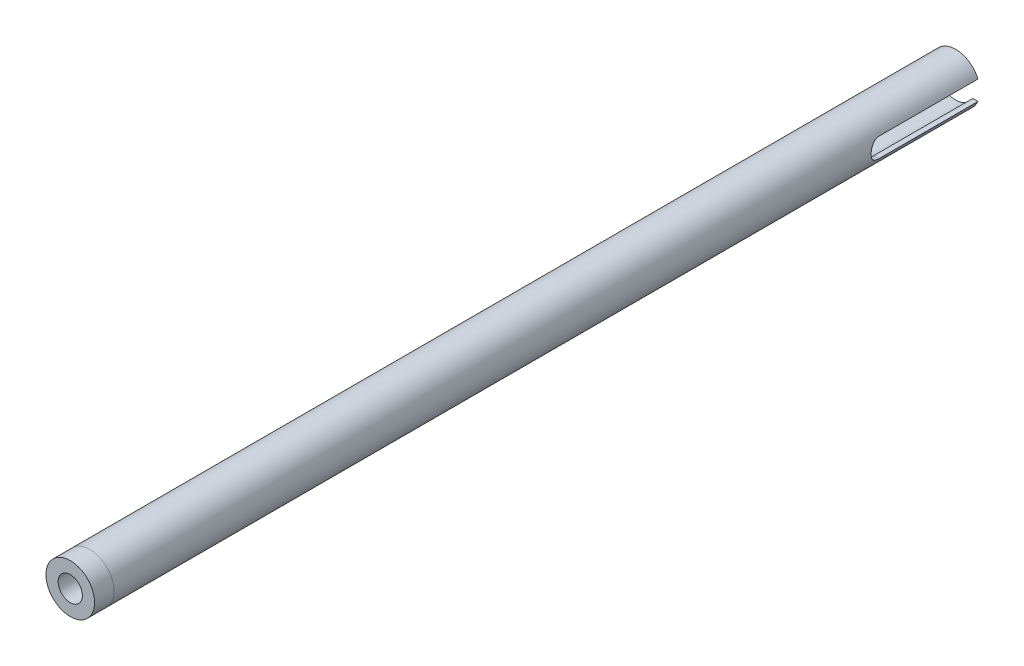
ISO-10303-21;
HEADER;
FILE_DESCRIPTION(('STEP AP214'),'2;1');
FILE_NAME('part.step','',(''),(''),'','','');
FILE_SCHEMA(('AUTOMOTIVE_DESIGN { 1 0 10303 214 1 1 1 1 }'));
ENDSEC;
DATA;
#1=APPLICATION_CONTEXT('core data for automotive mechanical design processes');
#2=APPLICATION_PROTOCOL_DEFINITION('international standard','automotive_design',2000,#1);
#3=PRODUCT_CONTEXT('',#1,'mechanical');
#4=PRODUCT('Part','Part','',(#3));
#5=PRODUCT_RELATED_PRODUCT_CATEGORY('part','',(#4));
#6=PRODUCT_DEFINITION_FORMATION('','',#4);
#7=PRODUCT_DEFINITION_CONTEXT('part definition',#1,'design');
#8=PRODUCT_DEFINITION('design','',#6,#7);
#9=PRODUCT_DEFINITION_SHAPE('','',#8);
#10=(LENGTH_UNIT() NAMED_UNIT(*) SI_UNIT(.MILLI.,.METRE.));
#11=(NAMED_UNIT(*) PLANE_ANGLE_UNIT() SI_UNIT($,.RADIAN.));
#12=(NAMED_UNIT(*) SI_UNIT($,.STERADIAN.) SOLID_ANGLE_UNIT());
#13=UNCERTAINTY_MEASURE_WITH_UNIT(LENGTH_MEASURE(1.E-05),#10,'distance_accuracy_value','');
#14=(GEOMETRIC_REPRESENTATION_CONTEXT(3) GLOBAL_UNCERTAINTY_ASSIGNED_CONTEXT((#13)) GLOBAL_UNIT_ASSIGNED_CONTEXT((#10,
#11,#12)) REPRESENTATION_CONTEXT('',''));
#15=CARTESIAN_POINT('',(0.,0.,0.));
#16=DIRECTION('',(0.,0.,1.));
#17=DIRECTION('',(1.,0.,0.));
#18=AXIS2_PLACEMENT_3D('',#15,#16,#17);
#19=CARTESIAN_POINT('',(0.,0.,-289.205127196244));
#20=DIRECTION('',(0.,0.,1.));
#21=DIRECTION('',(1.,0.,0.));
#22=AXIS2_PLACEMENT_3D('',#19,#20,#21);
#23=CYLINDRICAL_SURFACE('',#22,7.9375);
#24=CARTESIAN_POINT('',(0.,0.,-6.35));
#25=DIRECTION('',(0.,0.,1.));
#26=DIRECTION('',(1.,0.,0.));
#27=AXIS2_PLACEMENT_3D('',#24,#25,#26);
#28=CIRCLE('',#27,7.9375);
#29=CARTESIAN_POINT('',(7.9375,0.,-6.35));
#30=VERTEX_POINT('',#29);
#31=EDGE_CURVE('E167',#30,#30,#28,.T.);
#32=ORIENTED_EDGE('',*,*,#31,.F.);
#33=EDGE_LOOP('',(#32));
#34=FACE_BOUND('',#33,.T.);
#35=CARTESIAN_POINT('',(-7.2748389157424,3.175,-256.820127196244));
#36=CARTESIAN_POINT('',(-7.27482137043434,3.17501267173453,-256.734707080761));
#37=CARTESIAN_POINT('',(-7.27634297592672,3.17155313247793,-256.649296551199));
#38=CARTESIAN_POINT('',(-7.28233338484875,3.15778866907725,-256.479164546871));
#39=CARTESIAN_POINT('',(-7.28680106535325,3.14748635311323,-256.394442822012));
#40=CARTESIAN_POINT('',(-7.29852916312671,3.12019002880162,-256.226629122203));
#41=CARTESIAN_POINT('',(-7.30577831906487,3.10322299732751,-256.143531977444));
#42=CARTESIAN_POINT('',(-7.32282161153745,3.06278779397034,-255.979220875418));
#43=CARTESIAN_POINT('',(-7.33261590324725,3.03931922568674,-255.898007033305));
#44=CARTESIAN_POINT('',(-7.36535331460444,2.95952924342962,-255.658182210722));
#45=CARTESIAN_POINT('',(-7.39167595677839,2.89376893609239,-255.503057281919));
#46=CARTESIAN_POINT('',(-7.45033259991547,2.73920602658923,-255.205969855207));
#47=CARTESIAN_POINT('',(-7.48267254395243,2.65038060922872,-255.064020579989));
#48=CARTESIAN_POINT('',(-7.55175295441386,2.44684429809695,-254.78929981047));
#49=CARTESIAN_POINT('',(-7.58863404630154,2.33103943595689,-254.657372425958));
#50=CARTESIAN_POINT('',(-7.66147718953598,2.07914562663536,-254.414209542326));
#51=CARTESIAN_POINT('',(-7.69743902899202,1.94305205135848,-254.302978777398));
#52=CARTESIAN_POINT('',(-7.76611692840651,1.6477828266442,-254.100057577903));
#53=CARTESIAN_POINT('',(-7.79864638434712,1.48790317306357,-254.009323166499));
#54=CARTESIAN_POINT('',(-7.85502980346525,1.15369615984565,-253.856465613082));
#55=CARTESIAN_POINT('',(-7.87889360585224,0.979385463602728,-253.794310000464));
#56=CARTESIAN_POINT('',(-7.91022225039827,0.670405323433351,-253.713798356808));
#57=CARTESIAN_POINT('',(-7.92038443902171,0.537888188660434,-253.688120433399));
#58=CARTESIAN_POINT('',(-7.93061686811603,0.337231082382101,-253.662365350317));
#59=CARTESIAN_POINT('',(-7.93319257341971,0.269991647180293,-253.655907253037));
#60=CARTESIAN_POINT('',(-7.93663621925193,0.135173873369594,-253.647286235285));
#61=CARTESIAN_POINT('',(-7.93750363389236,0.0675954368175856,-253.645124637466));
#62=CARTESIAN_POINT('',(-7.9375,0.,-253.645127196244));
#63=B_SPLINE_CURVE_WITH_KNOTS('',3,(#35,#36,#37,#38,#39,#40,#41,#42,#43,#44,#45,#46,#47,#48,#49,
#50,#51,#52,#53,#54,#55,#56,#57,#58,#59,#60,#61,#62),.UNSPECIFIED.,.F.,.F.,(4,2,2,2,2,2,2,2,2,2,
2,2,2,4),(0.,0.256160797396612,0.512224013007114,0.767261264672295,1.02231406945471,
1.53142416248594,2.04103978047897,2.57679273649398,3.11266809162683,3.6699113602974,
4.22651992730645,4.63134321412667,4.8339937586662,5.03670667834028),.UNSPECIFIED.);
#64=CARTESIAN_POINT('',(-7.2748389157424,3.175,-256.820127196244));
#65=VERTEX_POINT('',#64);
#66=CARTESIAN_POINT('',(-7.9375,0.,-253.645127196244));
#67=VERTEX_POINT('',#66);
#68=EDGE_CURVE('E194',#65,#67,#63,.T.);
#69=ORIENTED_EDGE('',*,*,#68,.T.);
#70=CARTESIAN_POINT('',(-7.9375,0.,-253.645127196244));
#71=CARTESIAN_POINT('',(-7.93751279435796,-0.0856973243893202,-253.645115166075));
#72=CARTESIAN_POINT('',(-7.93611246860092,-0.171386675169295,-253.648596533547));
#73=CARTESIAN_POINT('',(-7.93058107051394,-0.342092796869091,-253.662452628881));
#74=CARTESIAN_POINT('',(-7.92645080745519,-0.427109759557719,-253.672825313865));
#75=CARTESIAN_POINT('',(-7.91557399086504,-0.595570690948314,-253.700322507932));
#76=CARTESIAN_POINT('',(-7.90883664469869,-0.679019123580001,-253.717423259205));
#77=CARTESIAN_POINT('',(-7.89293284658536,-0.844038966454637,-253.758190506678));
#78=CARTESIAN_POINT('',(-7.88376629739099,-0.925610301410299,-253.781857265735));
#79=CARTESIAN_POINT('',(-7.8529700783248,-1.16656173687588,-253.862364921434));
#80=CARTESIAN_POINT('',(-7.82802544143957,-1.3224472028299,-253.928757554311));
#81=CARTESIAN_POINT('',(-7.77174407779742,-1.62081902572889,-254.084802958304));
#82=CARTESIAN_POINT('',(-7.74040257287306,-1.76329524966531,-254.174473130367));
#83=CARTESIAN_POINT('',(-7.67287736621953,-2.03755465224644,-254.378926737882));
#84=CARTESIAN_POINT('',(-7.63654472176442,-2.16862853615059,-254.494613594614));
#85=CARTESIAN_POINT('',(-7.56380976030912,-2.4101102261282,-254.745907696323));
#86=CARTESIAN_POINT('',(-7.52740741976911,-2.52050895891189,-254.881523640805));
#87=CARTESIAN_POINT('',(-7.45683282624283,-2.72240939900243,-255.176222135671));
#88=CARTESIAN_POINT('',(-7.4228346735038,-2.81283701743191,-255.336086125587));
#89=CARTESIAN_POINT('',(-7.36333622196319,-2.96511894168389,-255.670212090383));
#90=CARTESIAN_POINT('',(-7.33782422493328,-3.02701262758154,-255.844453828142));
#91=CARTESIAN_POINT('',(-7.30424985403508,-3.10695047193342,-256.152757552794));
#92=CARTESIAN_POINT('',(-7.29331360019113,-3.13238569878909,-256.28461631368));
#93=CARTESIAN_POINT('',(-7.28227977674291,-3.15790858319001,-256.484333195374));
#94=CARTESIAN_POINT('',(-7.27949685702346,-3.16431127275807,-256.551281486133));
#95=CARTESIAN_POINT('',(-7.27577355567174,-3.17285909036155,-256.685523044));
#96=CARTESIAN_POINT('',(-7.27483380475762,-3.1750027609968,-256.752816421297));
#97=CARTESIAN_POINT('',(-7.2748389157424,-3.175,-256.820127196244));
#98=B_SPLINE_CURVE_WITH_KNOTS('',3,(#70,#71,#72,#73,#74,#75,#76,#77,#78,#79,#80,#81,#82,#83,#84,
#85,#86,#87,#88,#89,#90,#91,#92,#93,#94,#95,#96,#97),.UNSPECIFIED.,.F.,.F.,(4,2,2,2,2,2,2,2,2,2,
2,2,2,4),(0.,0.256996432008012,0.513916713336978,0.769937797705373,1.02596913282157,
1.53722547809955,2.04886511530059,2.58219314099272,3.11575467201799,3.67332953074268,
4.2301325519037,4.63306130520182,4.8348500382744,5.03670780985613),.UNSPECIFIED.);
#99=CARTESIAN_POINT('',(-7.2748389157424,-3.175,-256.820127196244));
#100=VERTEX_POINT('',#99);
#101=EDGE_CURVE('E146',#67,#100,#98,.T.);
#102=ORIENTED_EDGE('',*,*,#101,.T.);
#103=DIRECTION('',(0.,0.,-1.));
#104=VECTOR('',#103,1.);
#105=CARTESIAN_POINT('',(-7.2748389157424,-3.175,-253.645127196244));
#106=LINE('',#105,#104);
#107=CARTESIAN_POINT('',(-7.2748389157424,-3.175,-289.205127196244));
#108=VERTEX_POINT('',#107);
#109=EDGE_CURVE('E141',#100,#108,#106,.T.);
#110=ORIENTED_EDGE('',*,*,#109,.T.);
#111=CARTESIAN_POINT('',(0.,0.,-289.205127196244));
#112=DIRECTION('',(0.,0.,1.));
#113=DIRECTION('',(1.,0.,0.));
#114=AXIS2_PLACEMENT_3D('',#111,#112,#113);
#115=CIRCLE('',#114,7.9375);
#116=CARTESIAN_POINT('',(7.2748389157424,-3.175,-289.205127196244));
#117=VERTEX_POINT('',#116);
#118=EDGE_CURVE('E144',#108,#117,#115,.T.);
#119=ORIENTED_EDGE('',*,*,#118,.T.);
#120=DIRECTION('',(0.,0.,-1.));
#121=VECTOR('',#120,1.);
#122=CARTESIAN_POINT('',(7.2748389157424,-3.175,-253.645127196244));
#123=LINE('',#122,#121);
#124=CARTESIAN_POINT('',(7.2748389157424,-3.175,-256.820127196244));
#125=VERTEX_POINT('',#124);
#126=EDGE_CURVE('E427',#125,#117,#123,.T.);
#127=ORIENTED_EDGE('',*,*,#126,.F.);
#128=CARTESIAN_POINT('',(7.2748389157424,-3.175,-256.820127196244));
#129=CARTESIAN_POINT('',(7.27482137043434,-3.17501267173453,-256.734707080761));
#130=CARTESIAN_POINT('',(7.27634297592672,-3.17155313247793,-256.649296551199));
#131=CARTESIAN_POINT('',(7.28233338484875,-3.15778866907725,-256.479164546871));
#132=CARTESIAN_POINT('',(7.28680106535325,-3.14748635311323,-256.394442822012));
#133=CARTESIAN_POINT('',(7.29852916312671,-3.12019002880162,-256.226629122203));
#134=CARTESIAN_POINT('',(7.30577831906487,-3.10322299732751,-256.143531977444));
#135=CARTESIAN_POINT('',(7.32282161153745,-3.06278779397034,-255.979220875418));
#136=CARTESIAN_POINT('',(7.33261590324725,-3.03931922568674,-255.898007033305));
#137=CARTESIAN_POINT('',(7.36535331460444,-2.95952924342962,-255.658182210722));
#138=CARTESIAN_POINT('',(7.39167595677839,-2.89376893609239,-255.503057281919));
#139=CARTESIAN_POINT('',(7.45033259991547,-2.73920602658923,-255.205969855207));
#140=CARTESIAN_POINT('',(7.48267254395243,-2.65038060922872,-255.064020579989));
#141=CARTESIAN_POINT('',(7.55175295441386,-2.44684429809695,-254.78929981047));
#142=CARTESIAN_POINT('',(7.58863404630154,-2.33103943595689,-254.657372425958));
#143=CARTESIAN_POINT('',(7.66147718953598,-2.07914562663536,-254.414209542326));
#144=CARTESIAN_POINT('',(7.69743902899202,-1.94305205135848,-254.302978777398));
#145=CARTESIAN_POINT('',(7.76611692840651,-1.6477828266442,-254.100057577903));
#146=CARTESIAN_POINT('',(7.79864638434712,-1.48790317306357,-254.009323166499));
#147=CARTESIAN_POINT('',(7.85502980346525,-1.15369615984565,-253.856465613082));
#148=CARTESIAN_POINT('',(7.87889360585224,-0.979385463602728,-253.794310000464));
#149=CARTESIAN_POINT('',(7.91022225039827,-0.670405323433351,-253.713798356808));
#150=CARTESIAN_POINT('',(7.92038443902171,-0.537888188660434,-253.688120433399));
#151=CARTESIAN_POINT('',(7.93061686811603,-0.337231082382101,-253.662365350317));
#152=CARTESIAN_POINT('',(7.93319257341971,-0.269991647180293,-253.655907253037));
#153=CARTESIAN_POINT('',(7.93663621925193,-0.135173873369594,-253.647286235285));
#154=CARTESIAN_POINT('',(7.93750363389236,-0.0675954368175856,-253.645124637466));
#155=CARTESIAN_POINT('',(7.9375,0.,-253.645127196244));
#156=B_SPLINE_CURVE_WITH_KNOTS('',3,(#128,#129,#130,#131,#132,#133,#134,#135,#136,#137,#138,
#139,#140,#141,#142,#143,#144,#145,#146,#147,#148,#149,#150,#151,#152,#153,#154,#155),
.UNSPECIFIED.,.F.,.F.,(4,2,2,2,2,2,2,2,2,2,2,2,2,4),(0.,0.256160797396612,0.512224013007114,
0.767261264672295,1.02231406945471,1.53142416248594,2.04103978047897,2.57679273649398,
3.11266809162683,3.6699113602974,4.22651992730645,4.63134321412667,4.8339937586662,
5.03670667834028),.UNSPECIFIED.);
#157=CARTESIAN_POINT('',(7.9375,0.,-253.645127196244));
#158=VERTEX_POINT('',#157);
#159=EDGE_CURVE('E87',#125,#158,#156,.T.);
#160=ORIENTED_EDGE('',*,*,#159,.T.);
#161=CARTESIAN_POINT('',(7.9375,0.,-253.645127196244));
#162=CARTESIAN_POINT('',(7.93751279435796,0.0856973243893202,-253.645115166075));
#163=CARTESIAN_POINT('',(7.93611246860092,0.171386675169295,-253.648596533547));
#164=CARTESIAN_POINT('',(7.93058107051394,0.342092796869091,-253.662452628881));
#165=CARTESIAN_POINT('',(7.92645080745519,0.427109759557719,-253.672825313865));
#166=CARTESIAN_POINT('',(7.91557399086504,0.595570690948314,-253.700322507932));
#167=CARTESIAN_POINT('',(7.90883664469869,0.679019123580001,-253.717423259205));
#168=CARTESIAN_POINT('',(7.89293284658536,0.844038966454637,-253.758190506678));
#169=CARTESIAN_POINT('',(7.88376629739099,0.925610301410299,-253.781857265735));
#170=CARTESIAN_POINT('',(7.8529700783248,1.16656173687588,-253.862364921434));
#171=CARTESIAN_POINT('',(7.82802544143957,1.3224472028299,-253.928757554311));
#172=CARTESIAN_POINT('',(7.77174407779742,1.62081902572889,-254.084802958304));
#173=CARTESIAN_POINT('',(7.74040257287306,1.76329524966531,-254.174473130367));
#174=CARTESIAN_POINT('',(7.67287736621953,2.03755465224644,-254.378926737882));
#175=CARTESIAN_POINT('',(7.63654472176442,2.16862853615059,-254.494613594614));
#176=CARTESIAN_POINT('',(7.56380976030912,2.4101102261282,-254.745907696323));
#177=CARTESIAN_POINT('',(7.52740741976911,2.52050895891189,-254.881523640805));
#178=CARTESIAN_POINT('',(7.45683282624283,2.72240939900243,-255.176222135671));
#179=CARTESIAN_POINT('',(7.4228346735038,2.81283701743191,-255.336086125587));
#180=CARTESIAN_POINT('',(7.36333622196319,2.96511894168389,-255.670212090383));
#181=CARTESIAN_POINT('',(7.33782422493328,3.02701262758154,-255.844453828142));
#182=CARTESIAN_POINT('',(7.30424985403508,3.10695047193342,-256.152757552794));
#183=CARTESIAN_POINT('',(7.29331360019113,3.13238569878909,-256.28461631368));
#184=CARTESIAN_POINT('',(7.28227977674291,3.15790858319001,-256.484333195374));
#185=CARTESIAN_POINT('',(7.27949685702346,3.16431127275807,-256.551281486133));
#186=CARTESIAN_POINT('',(7.27577355567174,3.17285909036155,-256.685523044));
#187=CARTESIAN_POINT('',(7.27483380475762,3.1750027609968,-256.752816421297));
#188=CARTESIAN_POINT('',(7.2748389157424,3.175,-256.820127196244));
#189=B_SPLINE_CURVE_WITH_KNOTS('',3,(#161,#162,#163,#164,#165,#166,#167,#168,#169,#170,#171,
#172,#173,#174,#175,#176,#177,#178,#179,#180,#181,#182,#183,#184,#185,#186,#187,#188),
.UNSPECIFIED.,.F.,.F.,(4,2,2,2,2,2,2,2,2,2,2,2,2,4),(0.,0.256996432008012,0.513916713336978,
0.769937797705373,1.02596913282157,1.53722547809955,2.04886511530059,2.58219314099272,
3.11575467201799,3.67332953074268,4.2301325519037,4.63306130520182,4.8348500382744,
5.03670780985613),.UNSPECIFIED.);
#190=CARTESIAN_POINT('',(7.2748389157424,3.175,-256.820127196244));
#191=VERTEX_POINT('',#190);
#192=EDGE_CURVE('E73',#158,#191,#189,.T.);
#193=ORIENTED_EDGE('',*,*,#192,.T.);
#194=DIRECTION('',(0.,0.,-1.));
#195=VECTOR('',#194,1.);
#196=CARTESIAN_POINT('',(7.2748389157424,3.175,-253.645127196244));
#197=LINE('',#196,#195);
#198=CARTESIAN_POINT('',(7.2748389157424,3.175,-289.205127196244));
#199=VERTEX_POINT('',#198);
#200=EDGE_CURVE('E160',#191,#199,#197,.T.);
#201=ORIENTED_EDGE('',*,*,#200,.T.);
#202=CARTESIAN_POINT('',(-7.2748389157424,3.175,-289.205127196244));
#203=VERTEX_POINT('',#202);
#204=EDGE_CURVE('E166',#199,#203,#115,.T.);
#205=ORIENTED_EDGE('',*,*,#204,.T.);
#206=DIRECTION('',(0.,0.,-1.));
#207=VECTOR('',#206,1.);
#208=CARTESIAN_POINT('',(-7.2748389157424,3.175,-253.645127196244));
#209=LINE('',#208,#207);
#210=EDGE_CURVE('E420',#65,#203,#209,.T.);
#211=ORIENTED_EDGE('',*,*,#210,.F.);
#212=EDGE_LOOP('',(#69,#102,#110,#119,#127,#160,#193,#201,#205,#211));
#213=FACE_BOUND('',#212,.T.);
#214=ADVANCED_FACE('F63',(#34,#213),#23,.T.);
#215=CARTESIAN_POINT('',(0.,0.,-289.205127196244));
#216=DIRECTION('',(0.,0.,1.));
#217=DIRECTION('',(1.,0.,0.));
#218=AXIS2_PLACEMENT_3D('',#215,#216,#217);
#219=PLANE('',#218);
#220=DIRECTION('',(1.,0.,0.));
#221=VECTOR('',#220,1.);
#222=CARTESIAN_POINT('',(0.,-3.175,-289.205127196244));
#223=LINE('',#222,#221);
#224=CARTESIAN_POINT('',(-5.57246419907746,-3.175,-289.205127196244));
#225=VERTEX_POINT('',#224);
#226=EDGE_CURVE('E153',#108,#225,#223,.T.);
#227=ORIENTED_EDGE('',*,*,#226,.T.);
#228=CARTESIAN_POINT('',(0.,0.,-289.205127196244));
#229=DIRECTION('',(0.,0.,1.));
#230=DIRECTION('',(1.,0.,0.));
#231=AXIS2_PLACEMENT_3D('',#228,#229,#230);
#232=CIRCLE('',#231,6.4135);
#233=CARTESIAN_POINT('',(5.57246419907746,-3.175,-289.205127196244));
#234=VERTEX_POINT('',#233);
#235=EDGE_CURVE('E275',#225,#234,#232,.T.);
#236=ORIENTED_EDGE('',*,*,#235,.T.);
#237=DIRECTION('',(1.,0.,0.));
#238=VECTOR('',#237,1.);
#239=CARTESIAN_POINT('',(0.,-3.175,-289.205127196244));
#240=LINE('',#239,#238);
#241=EDGE_CURVE('E165',#234,#117,#240,.T.);
#242=ORIENTED_EDGE('',*,*,#241,.T.);
#243=ORIENTED_EDGE('',*,*,#118,.F.);
#244=EDGE_LOOP('',(#227,#236,#242,#243));
#245=FACE_BOUND('',#244,.T.);
#246=ADVANCED_FACE('F163',(#245),#219,.F.);
#247=CARTESIAN_POINT('',(0.,0.,-289.205127196244));
#248=DIRECTION('',(0.,0.,1.));
#249=DIRECTION('',(1.,0.,0.));
#250=AXIS2_PLACEMENT_3D('',#247,#248,#249);
#251=CYLINDRICAL_SURFACE('',#250,6.4135);
#252=CARTESIAN_POINT('',(0.,0.,-6.35));
#253=DIRECTION('',(0.,0.,1.));
#254=DIRECTION('',(1.,0.,0.));
#255=AXIS2_PLACEMENT_3D('',#252,#253,#254);
#256=CIRCLE('',#255,6.4135);
#257=CARTESIAN_POINT('',(6.4135,0.,-6.35));
#258=VERTEX_POINT('',#257);
#259=EDGE_CURVE('E149',#258,#258,#256,.T.);
#260=ORIENTED_EDGE('',*,*,#259,.T.);
#261=EDGE_LOOP('',(#260));
#262=FACE_BOUND('',#261,.T.);
#263=DIRECTION('',(0.,0.,-1.));
#264=VECTOR('',#263,1.);
#265=CARTESIAN_POINT('',(-5.57246419907746,-3.175,-253.645127196244));
#266=LINE('',#265,#264);
#267=CARTESIAN_POINT('',(-5.57246419907746,-3.175,-256.820127196244));
#268=VERTEX_POINT('',#267);
#269=EDGE_CURVE('E150',#268,#225,#266,.T.);
#270=ORIENTED_EDGE('',*,*,#269,.F.);
#271=CARTESIAN_POINT('',(-5.57246419907746,-3.175,-256.820127196244));
#272=CARTESIAN_POINT('',(-5.57244013006406,-3.17501485930532,-256.736848083205));
#273=CARTESIAN_POINT('',(-5.57433046393327,-3.17172393593588,-256.653582316335));
#274=CARTESIAN_POINT('',(-5.58175879139227,-3.1586474174694,-256.487774731523));
#275=CARTESIAN_POINT('',(-5.58729459414878,-3.14886572313218,-256.405232508922));
#276=CARTESIAN_POINT('',(-5.60179156831921,-3.12299843383606,-256.241935702193));
#277=CARTESIAN_POINT('',(-5.61073298145,-3.10694918790096,-256.161173597279));
#278=CARTESIAN_POINT('',(-5.63171276239417,-3.06875665913499,-256.001529681778));
#279=CARTESIAN_POINT('',(-5.64375147558632,-3.04661269666535,-255.922648081958));
#280=CARTESIAN_POINT('',(-5.6838799338154,-2.97148657354665,-255.68991490696));
#281=CARTESIAN_POINT('',(-5.71602843451585,-2.9097324304215,-255.539494409721));
#282=CARTESIAN_POINT('',(-5.78746445334562,-2.76491119647659,-255.251037192893));
#283=CARTESIAN_POINT('',(-5.82676307252431,-2.68181088046088,-255.113020235527));
#284=CARTESIAN_POINT('',(-5.91189137020974,-2.48887418737119,-254.841223151498));
#285=CARTESIAN_POINT('',(-5.95799203211626,-2.37743022169017,-254.708666349047));
#286=CARTESIAN_POINT('',(-6.04933625068998,-2.1343317962695,-254.463198679974));
#287=CARTESIAN_POINT('',(-6.09457954365871,-2.00267122837298,-254.350293772961));
#288=CARTESIAN_POINT('',(-6.18270630442022,-1.71220053093684,-254.139974480509));
#289=CARTESIAN_POINT('',(-6.22523407848511,-1.55216870534977,-254.044084730078));
#290=CARTESIAN_POINT('',(-6.29953728626817,-1.21586879246633,-253.881235833761));
#291=CARTESIAN_POINT('',(-6.33132906884324,-1.03962591706377,-253.814232655718));
#292=CARTESIAN_POINT('',(-6.37455801221378,-0.719418942476251,-253.724360823387));
#293=CARTESIAN_POINT('',(-6.38903678436651,-0.577736145507957,-253.694788109023));
#294=CARTESIAN_POINT('',(-6.40364692368403,-0.362616983152035,-253.665067034708));
#295=CARTESIAN_POINT('',(-6.40733246196224,-0.290370591494077,-253.657599522071));
#296=CARTESIAN_POINT('',(-6.41226237468065,-0.145424356491906,-253.647626633133));
#297=CARTESIAN_POINT('',(-6.41350576158006,-0.072724341630371,-253.645123264196));
#298=CARTESIAN_POINT('',(-6.4135,0.,-253.645127196244));
#299=B_SPLINE_CURVE_WITH_KNOTS('',3,(#271,#272,#273,#274,#275,#276,#277,#278,#279,#280,#281,
#282,#283,#284,#285,#286,#287,#288,#289,#290,#291,#292,#293,#294,#295,#296,#297,#298),
.UNSPECIFIED.,.F.,.F.,(4,2,2,2,2,2,2,2,2,2,2,2,2,4),(0.,0.249729002226553,0.499308060527526,
0.747460667546715,0.995640957972498,1.49055300136661,1.98624009021394,2.52160227908796,
3.05712653941521,3.62817923327589,4.19835836008502,4.63305000595099,4.85103401853339,
5.06910615989469),.UNSPECIFIED.);
#300=CARTESIAN_POINT('',(-6.4135,0.,-253.645127196244));
#301=VERTEX_POINT('',#300);
#302=EDGE_CURVE('E221',#268,#301,#299,.T.);
#303=ORIENTED_EDGE('',*,*,#302,.T.);
#304=CARTESIAN_POINT('',(-6.4135,0.,-253.645127196244));
#305=CARTESIAN_POINT('',(-6.41351478956106,0.0839162873638173,-253.645113796348));
#306=CARTESIAN_POINT('',(-6.41185341043851,0.167823114288178,-253.648453722395));
#307=CARTESIAN_POINT('',(-6.40528923860734,0.334952536326365,-253.661736163));
#308=CARTESIAN_POINT('',(-6.40038773102953,0.41817538948009,-253.671676059821));
#309=CARTESIAN_POINT('',(-6.38748331817869,0.582965498785221,-253.697994864339));
#310=CARTESIAN_POINT('',(-6.37949454331383,0.664538541389254,-253.714344439827));
#311=CARTESIAN_POINT('',(-6.36062930478242,0.82582159525237,-253.75328274342));
#312=CARTESIAN_POINT('',(-6.34975266552956,0.905531492908813,-253.775871850901));
#313=CARTESIAN_POINT('',(-6.31319792977547,1.14087800407252,-253.852608413661));
#314=CARTESIAN_POINT('',(-6.28356695572383,1.29306927815055,-253.915780061849));
#315=CARTESIAN_POINT('',(-6.21648032622801,1.58455945770354,-254.063930803829));
#316=CARTESIAN_POINT('',(-6.17901685649498,1.72384528592309,-254.148931695608));
#317=CARTESIAN_POINT('',(-6.09713913910647,1.99475482128857,-254.34403183386));
#318=CARTESIAN_POINT('',(-6.05244508581476,2.12544046453043,-254.455316710598));
#319=CARTESIAN_POINT('',(-5.96206469267669,2.36716277188881,-254.697286156763));
#320=CARTESIAN_POINT('',(-5.9163776032387,2.47818397002903,-254.827985848603));
#321=CARTESIAN_POINT('',(-5.82517699615972,2.68591268931947,-255.117031677555));
#322=CARTESIAN_POINT('',(-5.77994318763785,2.78087960507694,-255.276726872135));
#323=CARTESIAN_POINT('',(-5.69959190124919,2.9420744279085,-255.612110149317));
#324=CARTESIAN_POINT('',(-5.66445328320705,3.00836254036259,-255.787763782488));
#325=CARTESIAN_POINT('',(-5.61637168534322,3.09697219420916,-256.106215156882));
#326=CARTESIAN_POINT('',(-5.60011055849822,3.12606223436071,-256.246629759542));
#327=CARTESIAN_POINT('',(-5.58363385282995,3.15533369889113,-256.460006637784));
#328=CARTESIAN_POINT('',(-5.57946041232981,3.16269716900746,-256.531738362666));
#329=CARTESIAN_POINT('',(-5.57386984218861,3.17253394278506,-256.675680302709));
#330=CARTESIAN_POINT('',(-5.57245416126573,3.17500467618403,-256.74789074938));
#331=CARTESIAN_POINT('',(-5.57246419907746,3.175,-256.820127196244));
#332=B_SPLINE_CURVE_WITH_KNOTS('',3,(#304,#305,#306,#307,#308,#309,#310,#311,#312,#313,#314,
#315,#316,#317,#318,#319,#320,#321,#322,#323,#324,#325,#326,#327,#328,#329,#330,#331),
.UNSPECIFIED.,.F.,.F.,(4,2,2,2,2,2,2,2,2,2,2,2,2,4),(0.,0.251650249697321,0.503200747298848,
0.753613280993143,1.00404104361821,1.50387930503277,2.00421864304452,2.53410176460236,
3.06439980342595,3.63519589642623,4.20478783377489,4.63602373673199,4.85251353275909,
5.06911702550462),.UNSPECIFIED.);
#333=CARTESIAN_POINT('',(-5.57246419907746,3.175,-256.820127196244));
#334=VERTEX_POINT('',#333);
#335=EDGE_CURVE('E186',#301,#334,#332,.T.);
#336=ORIENTED_EDGE('',*,*,#335,.T.);
#337=DIRECTION('',(0.,0.,-1.));
#338=VECTOR('',#337,1.);
#339=CARTESIAN_POINT('',(-5.57246419907746,3.175,-253.645127196244));
#340=LINE('',#339,#338);
#341=CARTESIAN_POINT('',(-5.57246419907746,3.175,-289.205127196244));
#342=VERTEX_POINT('',#341);
#343=EDGE_CURVE('E417',#334,#342,#340,.T.);
#344=ORIENTED_EDGE('',*,*,#343,.T.);
#345=CARTESIAN_POINT('',(5.57246419907746,3.175,-289.205127196244));
#346=VERTEX_POINT('',#345);
#347=EDGE_CURVE('E172',#346,#342,#232,.T.);
#348=ORIENTED_EDGE('',*,*,#347,.F.);
#349=DIRECTION('',(0.,0.,-1.));
#350=VECTOR('',#349,1.);
#351=CARTESIAN_POINT('',(5.57246419907746,3.175,-253.645127196244));
#352=LINE('',#351,#350);
#353=CARTESIAN_POINT('',(5.57246419907746,3.175,-256.820127196244));
#354=VERTEX_POINT('',#353);
#355=EDGE_CURVE('E269',#354,#346,#352,.T.);
#356=ORIENTED_EDGE('',*,*,#355,.F.);
#357=CARTESIAN_POINT('',(5.57246419907746,3.175,-256.820127196244));
#358=CARTESIAN_POINT('',(5.57244013006406,3.17501485930532,-256.736848083205));
#359=CARTESIAN_POINT('',(5.57433046393327,3.17172393593588,-256.653582316335));
#360=CARTESIAN_POINT('',(5.58175879139227,3.1586474174694,-256.487774731523));
#361=CARTESIAN_POINT('',(5.58729459414878,3.14886572313218,-256.405232508922));
#362=CARTESIAN_POINT('',(5.60179156831921,3.12299843383606,-256.241935702193));
#363=CARTESIAN_POINT('',(5.61073298145,3.10694918790096,-256.161173597279));
#364=CARTESIAN_POINT('',(5.63171276239417,3.06875665913499,-256.001529681778));
#365=CARTESIAN_POINT('',(5.64375147558632,3.04661269666535,-255.922648081958));
#366=CARTESIAN_POINT('',(5.6838799338154,2.97148657354665,-255.68991490696));
#367=CARTESIAN_POINT('',(5.71602843451585,2.9097324304215,-255.539494409721));
#368=CARTESIAN_POINT('',(5.78746445334562,2.76491119647659,-255.251037192893));
#369=CARTESIAN_POINT('',(5.82676307252431,2.68181088046088,-255.113020235527));
#370=CARTESIAN_POINT('',(5.91189137020974,2.48887418737119,-254.841223151498));
#371=CARTESIAN_POINT('',(5.95799203211626,2.37743022169017,-254.708666349047));
#372=CARTESIAN_POINT('',(6.04933625068998,2.1343317962695,-254.463198679974));
#373=CARTESIAN_POINT('',(6.09457954365871,2.00267122837298,-254.350293772961));
#374=CARTESIAN_POINT('',(6.18270630442022,1.71220053093684,-254.139974480509));
#375=CARTESIAN_POINT('',(6.22523407848511,1.55216870534977,-254.044084730078));
#376=CARTESIAN_POINT('',(6.29953728626817,1.21586879246633,-253.881235833761));
#377=CARTESIAN_POINT('',(6.33132906884324,1.03962591706377,-253.814232655718));
#378=CARTESIAN_POINT('',(6.37455801221378,0.719418942476251,-253.724360823387));
#379=CARTESIAN_POINT('',(6.38903678436651,0.577736145507957,-253.694788109023));
#380=CARTESIAN_POINT('',(6.40364692368403,0.362616983152035,-253.665067034708));
#381=CARTESIAN_POINT('',(6.40733246196224,0.290370591494077,-253.657599522071));
#382=CARTESIAN_POINT('',(6.41226237468065,0.145424356491906,-253.647626633133));
#383=CARTESIAN_POINT('',(6.41350576158006,0.072724341630371,-253.645123264196));
#384=CARTESIAN_POINT('',(6.4135,0.,-253.645127196244));
#385=B_SPLINE_CURVE_WITH_KNOTS('',3,(#357,#358,#359,#360,#361,#362,#363,#364,#365,#366,#367,
#368,#369,#370,#371,#372,#373,#374,#375,#376,#377,#378,#379,#380,#381,#382,#383,#384),
.UNSPECIFIED.,.F.,.F.,(4,2,2,2,2,2,2,2,2,2,2,2,2,4),(0.,0.249729002226553,0.499308060527526,
0.747460667546715,0.995640957972498,1.49055300136661,1.98624009021394,2.52160227908796,
3.05712653941521,3.62817923327589,4.19835836008502,4.63305000595099,4.85103401853339,
5.06910615989469),.UNSPECIFIED.);
#386=CARTESIAN_POINT('',(6.4135,0.,-253.645127196244));
#387=VERTEX_POINT('',#386);
#388=EDGE_CURVE('E13',#354,#387,#385,.T.);
#389=ORIENTED_EDGE('',*,*,#388,.T.);
#390=CARTESIAN_POINT('',(6.4135,0.,-253.645127196244));
#391=CARTESIAN_POINT('',(6.41351478956106,-0.0839162873638173,-253.645113796348));
#392=CARTESIAN_POINT('',(6.41185341043851,-0.167823114288178,-253.648453722395));
#393=CARTESIAN_POINT('',(6.40528923860734,-0.334952536326365,-253.661736163));
#394=CARTESIAN_POINT('',(6.40038773102953,-0.41817538948009,-253.671676059821));
#395=CARTESIAN_POINT('',(6.38748331817869,-0.582965498785221,-253.697994864339));
#396=CARTESIAN_POINT('',(6.37949454331383,-0.664538541389254,-253.714344439827));
#397=CARTESIAN_POINT('',(6.36062930478242,-0.82582159525237,-253.75328274342));
#398=CARTESIAN_POINT('',(6.34975266552956,-0.905531492908813,-253.775871850901));
#399=CARTESIAN_POINT('',(6.31319792977547,-1.14087800407252,-253.852608413661));
#400=CARTESIAN_POINT('',(6.28356695572383,-1.29306927815055,-253.915780061849));
#401=CARTESIAN_POINT('',(6.21648032622801,-1.58455945770354,-254.063930803829));
#402=CARTESIAN_POINT('',(6.17901685649498,-1.72384528592309,-254.148931695608));
#403=CARTESIAN_POINT('',(6.09713913910647,-1.99475482128857,-254.34403183386));
#404=CARTESIAN_POINT('',(6.05244508581476,-2.12544046453043,-254.455316710598));
#405=CARTESIAN_POINT('',(5.96206469267669,-2.36716277188881,-254.697286156763));
#406=CARTESIAN_POINT('',(5.9163776032387,-2.47818397002903,-254.827985848603));
#407=CARTESIAN_POINT('',(5.82517699615972,-2.68591268931947,-255.117031677555));
#408=CARTESIAN_POINT('',(5.77994318763785,-2.78087960507694,-255.276726872135));
#409=CARTESIAN_POINT('',(5.69959190124919,-2.9420744279085,-255.612110149317));
#410=CARTESIAN_POINT('',(5.66445328320705,-3.00836254036259,-255.787763782488));
#411=CARTESIAN_POINT('',(5.61637168534322,-3.09697219420916,-256.106215156882));
#412=CARTESIAN_POINT('',(5.60011055849822,-3.12606223436071,-256.246629759542));
#413=CARTESIAN_POINT('',(5.58363385282995,-3.15533369889113,-256.460006637784));
#414=CARTESIAN_POINT('',(5.57946041232981,-3.16269716900746,-256.531738362666));
#415=CARTESIAN_POINT('',(5.57386984218861,-3.17253394278506,-256.675680302709));
#416=CARTESIAN_POINT('',(5.57245416126573,-3.17500467618403,-256.74789074938));
#417=CARTESIAN_POINT('',(5.57246419907746,-3.175,-256.820127196244));
#418=B_SPLINE_CURVE_WITH_KNOTS('',3,(#390,#391,#392,#393,#394,#395,#396,#397,#398,#399,#400,
#401,#402,#403,#404,#405,#406,#407,#408,#409,#410,#411,#412,#413,#414,#415,#416,#417),
.UNSPECIFIED.,.F.,.F.,(4,2,2,2,2,2,2,2,2,2,2,2,2,4),(0.,0.251650249697321,0.503200747298848,
0.753613280993143,1.00404104361821,1.50387930503277,2.00421864304452,2.53410176460236,
3.06439980342595,3.63519589642623,4.20478783377489,4.63602373673199,4.85251353275909,
5.06911702550462),.UNSPECIFIED.);
#419=CARTESIAN_POINT('',(5.57246419907746,-3.175,-256.820127196244));
#420=VERTEX_POINT('',#419);
#421=EDGE_CURVE('E237',#387,#420,#418,.T.);
#422=ORIENTED_EDGE('',*,*,#421,.T.);
#423=DIRECTION('',(0.,0.,-1.));
#424=VECTOR('',#423,1.);
#425=CARTESIAN_POINT('',(5.57246419907746,-3.175,-253.645127196244));
#426=LINE('',#425,#424);
#427=EDGE_CURVE('E271',#420,#234,#426,.T.);
#428=ORIENTED_EDGE('',*,*,#427,.T.);
#429=ORIENTED_EDGE('',*,*,#235,.F.);
#430=EDGE_LOOP('',(#270,#303,#336,#344,#348,#356,#389,#422,#428,#429));
#431=FACE_BOUND('',#430,.T.);
#432=ADVANCED_FACE('F201',(#262,#431),#251,.F.);
#433=ORIENTED_EDGE('',*,*,#347,.T.);
#434=DIRECTION('',(1.,0.,0.));
#435=VECTOR('',#434,1.);
#436=CARTESIAN_POINT('',(0.,3.175,-289.205127196244));
#437=LINE('',#436,#435);
#438=EDGE_CURVE('E159',#203,#342,#437,.T.);
#439=ORIENTED_EDGE('',*,*,#438,.F.);
#440=ORIENTED_EDGE('',*,*,#204,.F.);
#441=DIRECTION('',(1.,0.,0.));
#442=VECTOR('',#441,1.);
#443=CARTESIAN_POINT('',(0.,3.175,-289.205127196244));
#444=LINE('',#443,#442);
#445=EDGE_CURVE('E253',#346,#199,#444,.T.);
#446=ORIENTED_EDGE('',*,*,#445,.F.);
#447=EDGE_LOOP('',(#433,#439,#440,#446));
#448=FACE_BOUND('',#447,.T.);
#449=ADVANCED_FACE('F286',(#448),#219,.F.);
#450=CARTESIAN_POINT('',(0.,0.,-6.35));
#451=DIRECTION('',(0.,0.,1.));
#452=DIRECTION('',(1.,0.,0.));
#453=AXIS2_PLACEMENT_3D('',#450,#451,#452);
#454=PLANE('',#453);
#455=ORIENTED_EDGE('',*,*,#259,.F.);
#456=EDGE_LOOP('',(#455));
#457=FACE_BOUND('',#456,.T.);
#458=ORIENTED_EDGE('',*,*,#31,.T.);
#459=EDGE_LOOP('',(#458));
#460=FACE_BOUND('',#459,.T.);
#461=ADVANCED_FACE('F283',(#457,#460),#454,.T.);
#462=CARTESIAN_POINT('',(0.,3.175,-253.645127196244));
#463=DIRECTION('',(0.,1.,0.));
#464=DIRECTION('',(0.,0.,1.));
#465=AXIS2_PLACEMENT_3D('',#462,#463,#464);
#466=PLANE('',#465);
#467=ORIENTED_EDGE('',*,*,#200,.F.);
#468=DIRECTION('',(1.,0.,0.));
#469=VECTOR('',#468,1.);
#470=CARTESIAN_POINT('',(5.57246419907746,3.175,-256.820127196244));
#471=LINE('',#470,#469);
#472=EDGE_CURVE('E184',#191,#354,#471,.F.);
#473=ORIENTED_EDGE('',*,*,#472,.T.);
#474=ORIENTED_EDGE('',*,*,#355,.T.);
#475=ORIENTED_EDGE('',*,*,#445,.T.);
#476=EDGE_LOOP('',(#467,#473,#474,#475));
#477=FACE_BOUND('',#476,.T.);
#478=ADVANCED_FACE('F266',(#477),#466,.F.);
#479=CARTESIAN_POINT('',(0.,-3.175,-253.645127196244));
#480=DIRECTION('',(0.,1.,0.));
#481=DIRECTION('',(0.,0.,1.));
#482=AXIS2_PLACEMENT_3D('',#479,#480,#481);
#483=PLANE('',#482);
#484=ORIENTED_EDGE('',*,*,#427,.F.);
#485=DIRECTION('',(1.,0.,0.));
#486=VECTOR('',#485,1.);
#487=CARTESIAN_POINT('',(0.,-3.175,-256.820127196244));
#488=LINE('',#487,#486);
#489=EDGE_CURVE('E181',#420,#125,#488,.T.);
#490=ORIENTED_EDGE('',*,*,#489,.T.);
#491=ORIENTED_EDGE('',*,*,#126,.T.);
#492=ORIENTED_EDGE('',*,*,#241,.F.);
#493=EDGE_LOOP('',(#484,#490,#491,#492));
#494=FACE_BOUND('',#493,.T.);
#495=ADVANCED_FACE('F361',(#494),#483,.T.);
#496=CARTESIAN_POINT('',(0.,-3.175,-253.645127196244));
#497=DIRECTION('',(0.,1.,0.));
#498=DIRECTION('',(0.,0.,1.));
#499=AXIS2_PLACEMENT_3D('',#496,#497,#498);
#500=PLANE('',#499);
#501=ORIENTED_EDGE('',*,*,#109,.F.);
#502=DIRECTION('',(1.,0.,0.));
#503=VECTOR('',#502,1.);
#504=CARTESIAN_POINT('',(0.,-3.175,-256.820127196244));
#505=LINE('',#504,#503);
#506=EDGE_CURVE('E179',#100,#268,#505,.T.);
#507=ORIENTED_EDGE('',*,*,#506,.T.);
#508=ORIENTED_EDGE('',*,*,#269,.T.);
#509=ORIENTED_EDGE('',*,*,#226,.F.);
#510=EDGE_LOOP('',(#501,#507,#508,#509));
#511=FACE_BOUND('',#510,.T.);
#512=ADVANCED_FACE('F154',(#511),#500,.T.);
#513=CARTESIAN_POINT('',(0.,3.175,-253.645127196244));
#514=DIRECTION('',(0.,1.,0.));
#515=DIRECTION('',(0.,0.,1.));
#516=AXIS2_PLACEMENT_3D('',#513,#514,#515);
#517=PLANE('',#516);
#518=ORIENTED_EDGE('',*,*,#343,.F.);
#519=DIRECTION('',(1.,0.,0.));
#520=VECTOR('',#519,1.);
#521=CARTESIAN_POINT('',(-7.2748389157424,3.175,-256.820127196244));
#522=LINE('',#521,#520);
#523=EDGE_CURVE('E170',#334,#65,#522,.F.);
#524=ORIENTED_EDGE('',*,*,#523,.T.);
#525=ORIENTED_EDGE('',*,*,#210,.T.);
#526=ORIENTED_EDGE('',*,*,#438,.T.);
#527=EDGE_LOOP('',(#518,#524,#525,#526));
#528=FACE_BOUND('',#527,.T.);
#529=ADVANCED_FACE('F216',(#528),#517,.F.);
#530=CARTESIAN_POINT('',(0.,0.,-256.820127196244));
#531=DIRECTION('',(1.,0.,0.));
#532=DIRECTION('',(0.,0.,-1.));
#533=AXIS2_PLACEMENT_3D('',#530,#531,#532);
#534=CYLINDRICAL_SURFACE('',#533,3.175);
#535=ORIENTED_EDGE('',*,*,#506,.F.);
#536=ORIENTED_EDGE('',*,*,#101,.F.);
#537=DIRECTION('',(1.,0.,0.));
#538=VECTOR('',#537,1.);
#539=CARTESIAN_POINT('',(0.,0.,-253.645127196244));
#540=LINE('',#539,#538);
#541=EDGE_CURVE('E251',#301,#67,#540,.F.);
#542=ORIENTED_EDGE('',*,*,#541,.F.);
#543=ORIENTED_EDGE('',*,*,#302,.F.);
#544=EDGE_LOOP('',(#535,#536,#542,#543));
#545=FACE_BOUND('',#544,.T.);
#546=ADVANCED_FACE('F209',(#545),#534,.F.);
#547=CARTESIAN_POINT('',(0.,0.,-256.820127196244));
#548=DIRECTION('',(-1.,0.,0.));
#549=DIRECTION('',(0.,0.,1.));
#550=AXIS2_PLACEMENT_3D('',#547,#548,#549);
#551=CYLINDRICAL_SURFACE('',#550,3.175);
#552=ORIENTED_EDGE('',*,*,#68,.F.);
#553=ORIENTED_EDGE('',*,*,#523,.F.);
#554=ORIENTED_EDGE('',*,*,#335,.F.);
#555=ORIENTED_EDGE('',*,*,#541,.T.);
#556=EDGE_LOOP('',(#552,#553,#554,#555));
#557=FACE_BOUND('',#556,.T.);
#558=ADVANCED_FACE('F205',(#557),#551,.F.);
#559=CARTESIAN_POINT('',(0.,0.,-256.820127196244));
#560=DIRECTION('',(-1.,0.,0.));
#561=DIRECTION('',(0.,0.,1.));
#562=AXIS2_PLACEMENT_3D('',#559,#560,#561);
#563=CYLINDRICAL_SURFACE('',#562,3.175);
#564=DIRECTION('',(1.,0.,0.));
#565=VECTOR('',#564,1.);
#566=CARTESIAN_POINT('',(7.2748389157424,0.,-253.645127196244));
#567=LINE('',#566,#565);
#568=EDGE_CURVE('E68',#387,#158,#567,.T.);
#569=ORIENTED_EDGE('',*,*,#568,.F.);
#570=ORIENTED_EDGE('',*,*,#388,.F.);
#571=ORIENTED_EDGE('',*,*,#472,.F.);
#572=ORIENTED_EDGE('',*,*,#192,.F.);
#573=EDGE_LOOP('',(#569,#570,#571,#572));
#574=FACE_BOUND('',#573,.T.);
#575=ADVANCED_FACE('F65',(#574),#563,.F.);
#576=CARTESIAN_POINT('',(0.,0.,-256.820127196244));
#577=DIRECTION('',(1.,0.,0.));
#578=DIRECTION('',(0.,0.,-1.));
#579=AXIS2_PLACEMENT_3D('',#576,#577,#578);
#580=CYLINDRICAL_SURFACE('',#579,3.175);
#581=ORIENTED_EDGE('',*,*,#421,.F.);
#582=ORIENTED_EDGE('',*,*,#568,.T.);
#583=ORIENTED_EDGE('',*,*,#159,.F.);
#584=ORIENTED_EDGE('',*,*,#489,.F.);
#585=EDGE_LOOP('',(#581,#582,#583,#584));
#586=FACE_BOUND('',#585,.T.);
#587=ADVANCED_FACE('F218',(#586),#580,.F.);
#588=CLOSED_SHELL('',(#214,#246,#432,#449,#461,#478,#495,#512,#529,#546,#558,#575,#587));
#589=MANIFOLD_SOLID_BREP('B2',#588);
#590=CARTESIAN_POINT('',(0.,0.,-6.35));
#591=DIRECTION('',(0.,0.,1.));
#592=DIRECTION('',(1.,0.,0.));
#593=AXIS2_PLACEMENT_3D('',#590,#591,#592);
#594=CYLINDRICAL_SURFACE('',#593,7.9375);
#595=CARTESIAN_POINT('',(0.,0.,-6.35));
#596=DIRECTION('',(0.,0.,1.));
#597=DIRECTION('',(1.,0.,0.));
#598=AXIS2_PLACEMENT_3D('',#595,#596,#597);
#599=CIRCLE('',#598,7.9375);
#600=CARTESIAN_POINT('',(7.9375,0.,-6.35));
#601=VERTEX_POINT('',#600);
#602=EDGE_CURVE('E62',#601,#601,#599,.T.);
#603=ORIENTED_EDGE('',*,*,#602,.T.);
#604=EDGE_LOOP('',(#603));
#605=FACE_BOUND('',#604,.T.);
#606=CARTESIAN_POINT('',(0.,0.,0.));
#607=DIRECTION('',(0.,0.,1.));
#608=DIRECTION('',(1.,0.,0.));
#609=AXIS2_PLACEMENT_3D('',#606,#607,#608);
#610=CIRCLE('',#609,7.9375);
#611=CARTESIAN_POINT('',(7.9375,0.,0.));
#612=VERTEX_POINT('',#611);
#613=EDGE_CURVE('E465',#612,#612,#610,.T.);
#614=ORIENTED_EDGE('',*,*,#613,.F.);
#615=EDGE_LOOP('',(#614));
#616=FACE_BOUND('',#615,.T.);
#617=ADVANCED_FACE('F454',(#605,#616),#594,.T.);
#618=CARTESIAN_POINT('',(0.,0.,-6.35));
#619=DIRECTION('',(0.,0.,1.));
#620=DIRECTION('',(1.,0.,0.));
#621=AXIS2_PLACEMENT_3D('',#618,#619,#620);
#622=CYLINDRICAL_SURFACE('',#621,3.96875);
#623=CARTESIAN_POINT('',(0.,0.,0.));
#624=DIRECTION('',(0.,0.,1.));
#625=DIRECTION('',(1.,0.,0.));
#626=AXIS2_PLACEMENT_3D('',#623,#624,#625);
#627=CIRCLE('',#626,3.96875);
#628=CARTESIAN_POINT('',(3.96875,0.,0.));
#629=VERTEX_POINT('',#628);
#630=EDGE_CURVE('E457',#629,#629,#627,.T.);
#631=ORIENTED_EDGE('',*,*,#630,.T.);
#632=EDGE_LOOP('',(#631));
#633=FACE_BOUND('',#632,.T.);
#634=CARTESIAN_POINT('',(0.,0.,-15.875));
#635=DIRECTION('',(0.,0.,1.));
#636=DIRECTION('',(1.,0.,0.));
#637=AXIS2_PLACEMENT_3D('',#634,#635,#636);
#638=CIRCLE('',#637,3.96875);
#639=CARTESIAN_POINT('',(3.96875,0.,-15.875));
#640=VERTEX_POINT('',#639);
#641=EDGE_CURVE('E477',#640,#640,#638,.T.);
#642=ORIENTED_EDGE('',*,*,#641,.F.);
#643=EDGE_LOOP('',(#642));
#644=FACE_BOUND('',#643,.T.);
#645=ADVANCED_FACE('F485',(#633,#644),#622,.F.);
#646=CARTESIAN_POINT('',(0.,0.,-6.35));
#647=DIRECTION('',(0.,0.,1.));
#648=DIRECTION('',(1.,0.,0.));
#649=AXIS2_PLACEMENT_3D('',#646,#647,#648);
#650=PLANE('',#649);
#651=CARTESIAN_POINT('',(0.,0.,-6.35));
#652=DIRECTION('',(0.,0.,1.));
#653=DIRECTION('',(1.,0.,0.));
#654=AXIS2_PLACEMENT_3D('',#651,#652,#653);
#655=CIRCLE('',#654,6.4135);
#656=CARTESIAN_POINT('',(6.4135,0.,-6.35));
#657=VERTEX_POINT('',#656);
#658=EDGE_CURVE('E467',#657,#657,#655,.T.);
#659=ORIENTED_EDGE('',*,*,#658,.T.);
#660=EDGE_LOOP('',(#659));
#661=FACE_BOUND('',#660,.T.);
#662=ORIENTED_EDGE('',*,*,#602,.F.);
#663=EDGE_LOOP('',(#662));
#664=FACE_BOUND('',#663,.T.);
#665=ADVANCED_FACE('F487',(#661,#664),#650,.F.);
#666=CARTESIAN_POINT('',(0.,0.,0.));
#667=DIRECTION('',(0.,0.,1.));
#668=DIRECTION('',(1.,0.,0.));
#669=AXIS2_PLACEMENT_3D('',#666,#667,#668);
#670=PLANE('',#669);
#671=ORIENTED_EDGE('',*,*,#613,.T.);
#672=EDGE_LOOP('',(#671));
#673=FACE_BOUND('',#672,.T.);
#674=ORIENTED_EDGE('',*,*,#630,.F.);
#675=EDGE_LOOP('',(#674));
#676=FACE_BOUND('',#675,.T.);
#677=ADVANCED_FACE('F493',(#673,#676),#670,.T.);
#678=CARTESIAN_POINT('',(0.,0.,-15.875));
#679=DIRECTION('',(0.,0.,1.));
#680=DIRECTION('',(1.,0.,0.));
#681=AXIS2_PLACEMENT_3D('',#678,#679,#680);
#682=CYLINDRICAL_SURFACE('',#681,6.4135);
#683=CARTESIAN_POINT('',(0.,0.,-15.875));
#684=DIRECTION('',(0.,0.,1.));
#685=DIRECTION('',(1.,0.,0.));
#686=AXIS2_PLACEMENT_3D('',#683,#684,#685);
#687=CIRCLE('',#686,6.4135);
#688=CARTESIAN_POINT('',(6.4135,0.,-15.875));
#689=VERTEX_POINT('',#688);
#690=EDGE_CURVE('E470',#689,#689,#687,.T.);
#691=CARTESIAN_POINT('',(6.4135,0.,-15.875));
#692=CARTESIAN_POINT('',(6.4135,0.,-15.77578125));
#693=CARTESIAN_POINT('',(6.4135,0.,-15.6765625));
#694=CARTESIAN_POINT('',(6.4135,0.,-15.478125));
#695=CARTESIAN_POINT('',(6.4135,0.,-15.37890625));
#696=CARTESIAN_POINT('',(6.4135,0.,-15.18046875));
#697=CARTESIAN_POINT('',(6.4135,0.,-15.08125));
#698=CARTESIAN_POINT('',(6.4135,0.,-14.8828125));
#699=CARTESIAN_POINT('',(6.4135,0.,-14.78359375));
#700=CARTESIAN_POINT('',(6.4135,0.,-14.58515625));
#701=CARTESIAN_POINT('',(6.4135,0.,-14.4859375));
#702=CARTESIAN_POINT('',(6.4135,0.,-14.2875));
#703=CARTESIAN_POINT('',(6.4135,0.,-14.18828125));
#704=CARTESIAN_POINT('',(6.4135,0.,-13.98984375));
#705=CARTESIAN_POINT('',(6.4135,0.,-13.890625));
#706=CARTESIAN_POINT('',(6.4135,0.,-13.6921875));
#707=CARTESIAN_POINT('',(6.4135,0.,-13.59296875));
#708=CARTESIAN_POINT('',(6.4135,0.,-13.39453125));
#709=CARTESIAN_POINT('',(6.4135,0.,-13.2953125));
#710=CARTESIAN_POINT('',(6.4135,0.,-13.096875));
#711=CARTESIAN_POINT('',(6.4135,0.,-12.99765625));
#712=CARTESIAN_POINT('',(6.4135,0.,-12.79921875));
#713=CARTESIAN_POINT('',(6.4135,0.,-12.7));
#714=CARTESIAN_POINT('',(6.4135,0.,-12.5015625));
#715=CARTESIAN_POINT('',(6.4135,0.,-12.40234375));
#716=CARTESIAN_POINT('',(6.4135,0.,-12.20390625));
#717=CARTESIAN_POINT('',(6.4135,0.,-12.1046875));
#718=CARTESIAN_POINT('',(6.4135,0.,-11.90625));
#719=CARTESIAN_POINT('',(6.4135,0.,-11.80703125));
#720=CARTESIAN_POINT('',(6.4135,0.,-11.60859375));
#721=CARTESIAN_POINT('',(6.4135,0.,-11.509375));
#722=CARTESIAN_POINT('',(6.4135,0.,-11.3109375));
#723=CARTESIAN_POINT('',(6.4135,0.,-11.21171875));
#724=CARTESIAN_POINT('',(6.4135,0.,-11.01328125));
#725=CARTESIAN_POINT('',(6.4135,0.,-10.9140625));
#726=CARTESIAN_POINT('',(6.4135,0.,-10.715625));
#727=CARTESIAN_POINT('',(6.4135,0.,-10.61640625));
#728=CARTESIAN_POINT('',(6.4135,0.,-10.41796875));
#729=CARTESIAN_POINT('',(6.4135,0.,-10.31875));
#730=CARTESIAN_POINT('',(6.4135,0.,-10.1203125));
#731=CARTESIAN_POINT('',(6.4135,0.,-10.02109375));
#732=CARTESIAN_POINT('',(6.4135,0.,-9.82265625));
#733=CARTESIAN_POINT('',(6.4135,0.,-9.7234375));
#734=CARTESIAN_POINT('',(6.4135,0.,-9.525));
#735=CARTESIAN_POINT('',(6.4135,0.,-9.42578125));
#736=CARTESIAN_POINT('',(6.4135,0.,-9.22734375));
#737=CARTESIAN_POINT('',(6.4135,0.,-9.128125));
#738=CARTESIAN_POINT('',(6.4135,0.,-8.9296875));
#739=CARTESIAN_POINT('',(6.4135,0.,-8.83046875));
#740=CARTESIAN_POINT('',(6.4135,0.,-8.63203125));
#741=CARTESIAN_POINT('',(6.4135,0.,-8.5328125));
#742=CARTESIAN_POINT('',(6.4135,0.,-8.334375));
#743=CARTESIAN_POINT('',(6.4135,0.,-8.23515625));
#744=CARTESIAN_POINT('',(6.4135,0.,-8.03671875));
#745=CARTESIAN_POINT('',(6.4135,0.,-7.9375));
#746=CARTESIAN_POINT('',(6.4135,0.,-7.7390625));
#747=CARTESIAN_POINT('',(6.4135,0.,-7.63984375));
#748=CARTESIAN_POINT('',(6.4135,0.,-7.44140625));
#749=CARTESIAN_POINT('',(6.4135,0.,-7.3421875));
#750=CARTESIAN_POINT('',(6.4135,0.,-7.14375));
#751=CARTESIAN_POINT('',(6.4135,0.,-7.04453125));
#752=CARTESIAN_POINT('',(6.4135,0.,-6.84609375));
#753=CARTESIAN_POINT('',(6.4135,0.,-6.746875));
#754=CARTESIAN_POINT('',(6.4135,0.,-6.5484375));
#755=CARTESIAN_POINT('',(6.4135,0.,-6.44921875));
#756=CARTESIAN_POINT('',(6.4135,0.,-6.35));
#757=B_SPLINE_CURVE_WITH_KNOTS('',3,(#691,#692,#693,#694,#695,#696,#697,#698,#699,#700,#701,
#702,#703,#704,#705,#706,#707,#708,#709,#710,#711,#712,#713,#714,#715,#716,#717,#718,#719,#720,
#721,#722,#723,#724,#725,#726,#727,#728,#729,#730,#731,#732,#733,#734,#735,#736,#737,#738,#739,
#740,#741,#742,#743,#744,#745,#746,#747,#748,#749,#750,#751,#752,#753,#754,#755,#756),
.UNSPECIFIED.,.F.,.F.,(4,2,2,2,2,2,2,2,2,2,2,2,2,2,2,2,2,2,2,2,2,2,2,2,2,2,2,2,2,2,2,2,4),(0.,
0.297656250000002,0.595312500000002,0.892968750000002,1.190625,1.48828125,1.7859375,2.08359375,
2.38125,2.67890625,2.9765625,3.27421875,3.571875,3.86953125,4.1671875,4.46484375,4.7625,
5.06015625,5.3578125,5.65546875,5.953125,6.25078125,6.5484375,6.84609375,7.14375,7.44140625,
7.7390625,8.03671875,8.334375,8.63203125,8.9296875,9.22734375,9.525),.UNSPECIFIED.);
#758=EDGE_CURVE('BSEAM498',#689,#657,#757,.T.);
#759=ORIENTED_EDGE('',*,*,#690,.T.);
#760=ORIENTED_EDGE('',*,*,#658,.F.);
#761=ORIENTED_EDGE('',*,*,#758,.T.);
#762=ORIENTED_EDGE('',*,*,#758,.F.);
#763=EDGE_LOOP('',(#759,#761,#760,#762));
#764=FACE_BOUND('',#763,.T.);
#765=ADVANCED_FACE('F498',(#764),#682,.T.);
#766=CARTESIAN_POINT('',(0.,0.,-15.875));
#767=DIRECTION('',(0.,0.,1.));
#768=DIRECTION('',(1.,0.,0.));
#769=AXIS2_PLACEMENT_3D('',#766,#767,#768);
#770=PLANE('',#769);
#771=ORIENTED_EDGE('',*,*,#641,.T.);
#772=EDGE_LOOP('',(#771));
#773=FACE_BOUND('',#772,.T.);
#774=ORIENTED_EDGE('',*,*,#690,.F.);
#775=EDGE_LOOP('',(#774));
#776=FACE_BOUND('',#775,.T.);
#777=ADVANCED_FACE('F482',(#773,#776),#770,.F.);
#778=CLOSED_SHELL('',(#617,#645,#665,#677,#765,#777));
#779=MANIFOLD_SOLID_BREP('B7',#778);
#780=ADVANCED_BREP_SHAPE_REPRESENTATION('',(#18,#589,#779),#14);
#781=SHAPE_DEFINITION_REPRESENTATION(#9,#780);
ENDSEC;
END-ISO-10303-21;
